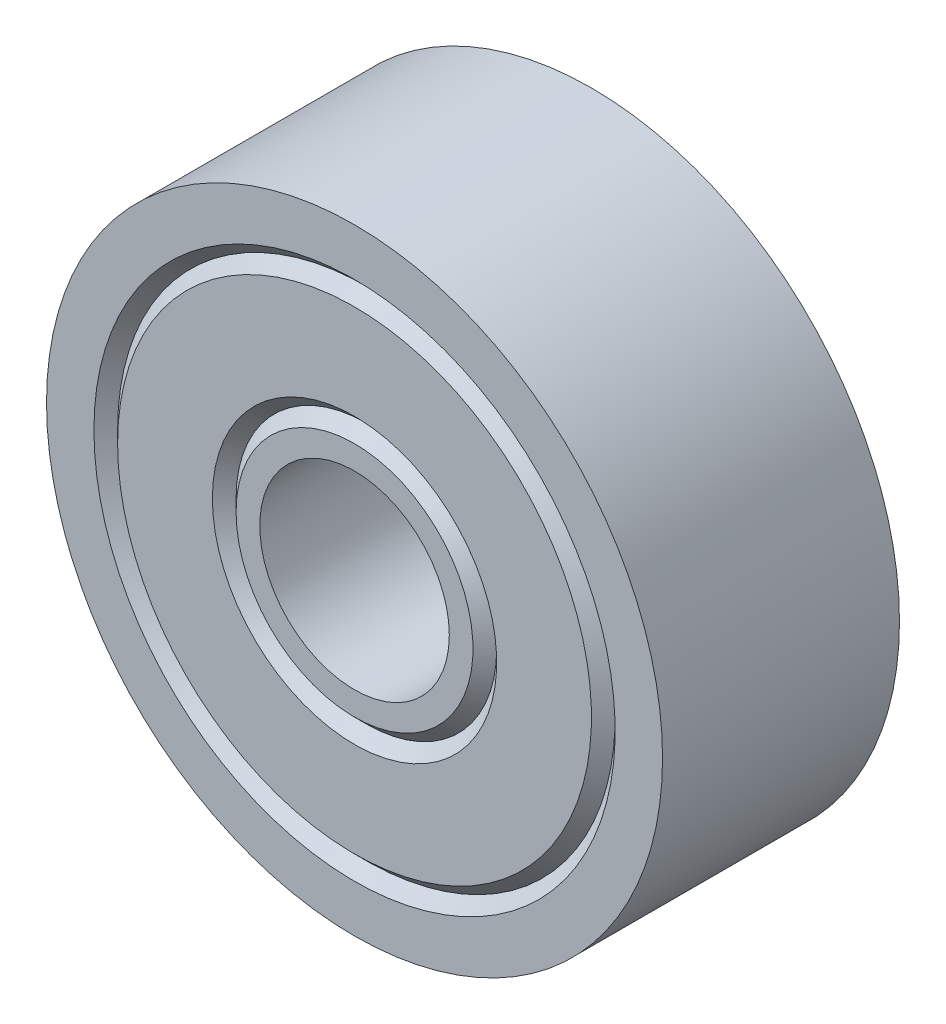
ISO-10303-21;
HEADER;
FILE_DESCRIPTION(('STEP AP214'),'2;1');
FILE_NAME('part.step','',(''),(''),'','','');
FILE_SCHEMA(('AUTOMOTIVE_DESIGN { 1 0 10303 214 1 1 1 1 }'));
ENDSEC;
DATA;
#1=APPLICATION_CONTEXT('core data for automotive mechanical design processes');
#2=APPLICATION_PROTOCOL_DEFINITION('international standard','automotive_design',2000,#1);
#3=PRODUCT_CONTEXT('',#1,'mechanical');
#4=PRODUCT('Part','Part','',(#3));
#5=PRODUCT_RELATED_PRODUCT_CATEGORY('part','',(#4));
#6=PRODUCT_DEFINITION_FORMATION('','',#4);
#7=PRODUCT_DEFINITION_CONTEXT('part definition',#1,'design');
#8=PRODUCT_DEFINITION('design','',#6,#7);
#9=PRODUCT_DEFINITION_SHAPE('','',#8);
#10=(LENGTH_UNIT() NAMED_UNIT(*) SI_UNIT(.MILLI.,.METRE.));
#11=(NAMED_UNIT(*) PLANE_ANGLE_UNIT() SI_UNIT($,.RADIAN.));
#12=(NAMED_UNIT(*) SI_UNIT($,.STERADIAN.) SOLID_ANGLE_UNIT());
#13=UNCERTAINTY_MEASURE_WITH_UNIT(LENGTH_MEASURE(1.E-05),#10,'distance_accuracy_value','');
#14=(GEOMETRIC_REPRESENTATION_CONTEXT(3) GLOBAL_UNCERTAINTY_ASSIGNED_CONTEXT((#13)) GLOBAL_UNIT_ASSIGNED_CONTEXT((#10,
#11,#12)) REPRESENTATION_CONTEXT('',''));
#15=CARTESIAN_POINT('',(0.,0.,0.));
#16=DIRECTION('',(0.,0.,1.));
#17=DIRECTION('',(1.,0.,0.));
#18=AXIS2_PLACEMENT_3D('',#15,#16,#17);
#19=CARTESIAN_POINT('',(0.,0.,0.));
#20=DIRECTION('',(0.,0.,1.));
#21=DIRECTION('',(1.,0.,0.));
#22=AXIS2_PLACEMENT_3D('',#19,#20,#21);
#23=PLANE('',#22);
#24=CARTESIAN_POINT('',(0.,0.,0.));
#25=DIRECTION('',(0.,0.,-1.));
#26=DIRECTION('',(-1.,0.,0.));
#27=AXIS2_PLACEMENT_3D('',#24,#25,#26);
#28=CIRCLE('',#27,5.);
#29=CARTESIAN_POINT('',(-5.,0.,0.));
#30=VERTEX_POINT('',#29);
#31=EDGE_CURVE('E81',#30,#30,#28,.T.);
#32=ORIENTED_EDGE('',*,*,#31,.T.);
#33=EDGE_LOOP('',(#32));
#34=FACE_BOUND('',#33,.T.);
#35=CARTESIAN_POINT('',(0.,0.,0.));
#36=DIRECTION('',(0.,0.,-1.));
#37=DIRECTION('',(-1.,0.,0.));
#38=AXIS2_PLACEMENT_3D('',#35,#36,#37);
#39=CIRCLE('',#38,3.);
#40=CARTESIAN_POINT('',(-3.,0.,0.));
#41=VERTEX_POINT('',#40);
#42=EDGE_CURVE('E69',#41,#41,#39,.T.);
#43=ORIENTED_EDGE('',*,*,#42,.F.);
#44=EDGE_LOOP('',(#43));
#45=FACE_BOUND('',#44,.T.);
#46=ADVANCED_FACE('F30',(#34,#45),#23,.F.);
#47=CARTESIAN_POINT('',(0.,0.,0.));
#48=DIRECTION('',(0.,0.,-1.));
#49=DIRECTION('',(-1.,0.,0.));
#50=AXIS2_PLACEMENT_3D('',#47,#48,#49);
#51=CIRCLE('',#50,2.5);
#52=CARTESIAN_POINT('',(-2.5,0.,0.));
#53=VERTEX_POINT('',#52);
#54=EDGE_CURVE('E72',#53,#53,#51,.T.);
#55=ORIENTED_EDGE('',*,*,#54,.T.);
#56=EDGE_LOOP('',(#55));
#57=FACE_BOUND('',#56,.T.);
#58=CARTESIAN_POINT('',(0.,0.,0.));
#59=DIRECTION('',(0.,0.,1.));
#60=DIRECTION('',(1.,0.,0.));
#61=AXIS2_PLACEMENT_3D('',#58,#59,#60);
#62=CIRCLE('',#61,2.);
#63=CARTESIAN_POINT('',(2.,0.,0.));
#64=VERTEX_POINT('',#63);
#65=EDGE_CURVE('E43',#64,#64,#62,.T.);
#66=ORIENTED_EDGE('',*,*,#65,.T.);
#67=EDGE_LOOP('',(#66));
#68=FACE_BOUND('',#67,.T.);
#69=ADVANCED_FACE('F104',(#57,#68),#23,.F.);
#70=CARTESIAN_POINT('',(0.,0.,5.));
#71=DIRECTION('',(0.,0.,1.));
#72=DIRECTION('',(1.,0.,0.));
#73=AXIS2_PLACEMENT_3D('',#70,#71,#72);
#74=PLANE('',#73);
#75=CARTESIAN_POINT('',(0.,0.,5.));
#76=DIRECTION('',(0.,0.,-1.));
#77=DIRECTION('',(-1.,0.,0.));
#78=AXIS2_PLACEMENT_3D('',#75,#76,#77);
#79=CIRCLE('',#78,3.);
#80=CARTESIAN_POINT('',(-3.,0.,5.));
#81=VERTEX_POINT('',#80);
#82=EDGE_CURVE('E63',#81,#81,#79,.T.);
#83=ORIENTED_EDGE('',*,*,#82,.T.);
#84=EDGE_LOOP('',(#83));
#85=FACE_BOUND('',#84,.T.);
#86=CARTESIAN_POINT('',(0.,0.,5.));
#87=DIRECTION('',(0.,0.,-1.));
#88=DIRECTION('',(-1.,0.,0.));
#89=AXIS2_PLACEMENT_3D('',#86,#87,#88);
#90=CIRCLE('',#89,5.);
#91=CARTESIAN_POINT('',(-5.,0.,5.));
#92=VERTEX_POINT('',#91);
#93=EDGE_CURVE('E51',#92,#92,#90,.T.);
#94=ORIENTED_EDGE('',*,*,#93,.F.);
#95=EDGE_LOOP('',(#94));
#96=FACE_BOUND('',#95,.T.);
#97=ADVANCED_FACE('F120',(#85,#96),#74,.T.);
#98=CARTESIAN_POINT('',(0.,0.,5.));
#99=DIRECTION('',(0.,0.,-1.));
#100=DIRECTION('',(-1.,0.,0.));
#101=AXIS2_PLACEMENT_3D('',#98,#99,#100);
#102=CIRCLE('',#101,5.5);
#103=CARTESIAN_POINT('',(-5.5,0.,5.));
#104=VERTEX_POINT('',#103);
#105=EDGE_CURVE('E54',#104,#104,#102,.T.);
#106=ORIENTED_EDGE('',*,*,#105,.T.);
#107=EDGE_LOOP('',(#106));
#108=FACE_BOUND('',#107,.T.);
#109=CARTESIAN_POINT('',(0.,0.,5.));
#110=DIRECTION('',(0.,0.,1.));
#111=DIRECTION('',(1.,0.,0.));
#112=AXIS2_PLACEMENT_3D('',#109,#110,#111);
#113=CIRCLE('',#112,6.5);
#114=CARTESIAN_POINT('',(6.5,0.,5.));
#115=VERTEX_POINT('',#114);
#116=EDGE_CURVE('E10',#115,#115,#113,.T.);
#117=ORIENTED_EDGE('',*,*,#116,.T.);
#118=EDGE_LOOP('',(#117));
#119=FACE_BOUND('',#118,.T.);
#120=ADVANCED_FACE('F124',(#108,#119),#74,.T.);
#121=CARTESIAN_POINT('',(0.,0.,5.));
#122=DIRECTION('',(0.,0.,-1.));
#123=DIRECTION('',(-1.,0.,0.));
#124=AXIS2_PLACEMENT_3D('',#121,#122,#123);
#125=CIRCLE('',#124,2.5);
#126=CARTESIAN_POINT('',(-2.5,0.,5.));
#127=VERTEX_POINT('',#126);
#128=EDGE_CURVE('E60',#127,#127,#125,.T.);
#129=ORIENTED_EDGE('',*,*,#128,.F.);
#130=EDGE_LOOP('',(#129));
#131=FACE_BOUND('',#130,.T.);
#132=CARTESIAN_POINT('',(0.,0.,5.));
#133=DIRECTION('',(0.,0.,1.));
#134=DIRECTION('',(1.,0.,0.));
#135=AXIS2_PLACEMENT_3D('',#132,#133,#134);
#136=CIRCLE('',#135,2.);
#137=CARTESIAN_POINT('',(2.,0.,5.));
#138=VERTEX_POINT('',#137);
#139=EDGE_CURVE('E41',#138,#138,#136,.T.);
#140=ORIENTED_EDGE('',*,*,#139,.F.);
#141=EDGE_LOOP('',(#140));
#142=FACE_BOUND('',#141,.T.);
#143=ADVANCED_FACE('F103',(#131,#142),#74,.T.);
#144=CARTESIAN_POINT('',(0.,0.,0.));
#145=DIRECTION('',(0.,0.,-1.));
#146=DIRECTION('',(-1.,0.,0.));
#147=AXIS2_PLACEMENT_3D('',#144,#145,#146);
#148=CIRCLE('',#147,5.5);
#149=CARTESIAN_POINT('',(-5.5,0.,0.));
#150=VERTEX_POINT('',#149);
#151=EDGE_CURVE('E78',#150,#150,#148,.T.);
#152=ORIENTED_EDGE('',*,*,#151,.F.);
#153=EDGE_LOOP('',(#152));
#154=FACE_BOUND('',#153,.T.);
#155=CARTESIAN_POINT('',(0.,0.,0.));
#156=DIRECTION('',(0.,0.,1.));
#157=DIRECTION('',(1.,0.,0.));
#158=AXIS2_PLACEMENT_3D('',#155,#156,#157);
#159=CIRCLE('',#158,6.5);
#160=CARTESIAN_POINT('',(6.5,0.,0.));
#161=VERTEX_POINT('',#160);
#162=EDGE_CURVE('E34',#161,#161,#159,.T.);
#163=ORIENTED_EDGE('',*,*,#162,.F.);
#164=EDGE_LOOP('',(#163));
#165=FACE_BOUND('',#164,.T.);
#166=ADVANCED_FACE('F100',(#154,#165),#23,.F.);
#167=CARTESIAN_POINT('',(0.,0.,5.));
#168=DIRECTION('',(0.,0.,-1.));
#169=DIRECTION('',(-1.,0.,0.));
#170=AXIS2_PLACEMENT_3D('',#167,#168,#169);
#171=CYLINDRICAL_SURFACE('',#170,6.5);
#172=ORIENTED_EDGE('',*,*,#116,.F.);
#173=EDGE_LOOP('',(#172));
#174=FACE_BOUND('',#173,.T.);
#175=ORIENTED_EDGE('',*,*,#162,.T.);
#176=EDGE_LOOP('',(#175));
#177=FACE_BOUND('',#176,.T.);
#178=ADVANCED_FACE('F32',(#174,#177),#171,.T.);
#179=CARTESIAN_POINT('',(0.,0.,5.));
#180=DIRECTION('',(0.,0.,-1.));
#181=DIRECTION('',(-1.,0.,0.));
#182=AXIS2_PLACEMENT_3D('',#179,#180,#181);
#183=CYLINDRICAL_SURFACE('',#182,2.);
#184=ORIENTED_EDGE('',*,*,#139,.T.);
#185=EDGE_LOOP('',(#184));
#186=FACE_BOUND('',#185,.T.);
#187=ORIENTED_EDGE('',*,*,#65,.F.);
#188=EDGE_LOOP('',(#187));
#189=FACE_BOUND('',#188,.T.);
#190=ADVANCED_FACE('F108',(#186,#189),#183,.F.);
#191=CARTESIAN_POINT('',(0.,0.,4.75));
#192=DIRECTION('',(0.,0.,1.));
#193=DIRECTION('',(1.,0.,0.));
#194=AXIS2_PLACEMENT_3D('',#191,#192,#193);
#195=CONICAL_SURFACE('',#194,5.25,0.785398163397453);
#196=ORIENTED_EDGE('',*,*,#105,.F.);
#197=EDGE_LOOP('',(#196));
#198=FACE_BOUND('',#197,.T.);
#199=CARTESIAN_POINT('',(0.,0.,4.75));
#200=DIRECTION('',(0.,0.,-1.));
#201=DIRECTION('',(-1.,0.,0.));
#202=AXIS2_PLACEMENT_3D('',#199,#200,#201);
#203=CIRCLE('',#202,5.25);
#204=CARTESIAN_POINT('',(-5.25,0.,4.75));
#205=VERTEX_POINT('',#204);
#206=EDGE_CURVE('E46',#205,#205,#203,.T.);
#207=ORIENTED_EDGE('',*,*,#206,.T.);
#208=EDGE_LOOP('',(#207));
#209=FACE_BOUND('',#208,.T.);
#210=ADVANCED_FACE('F113',(#198,#209),#195,.F.);
#211=CARTESIAN_POINT('',(0.,0.,5.));
#212=DIRECTION('',(0.,0.,-1.));
#213=DIRECTION('',(-1.,0.,0.));
#214=AXIS2_PLACEMENT_3D('',#211,#212,#213);
#215=CONICAL_SURFACE('',#214,5.,0.785398163397448);
#216=ORIENTED_EDGE('',*,*,#206,.F.);
#217=EDGE_LOOP('',(#216));
#218=FACE_BOUND('',#217,.T.);
#219=ORIENTED_EDGE('',*,*,#93,.T.);
#220=EDGE_LOOP('',(#219));
#221=FACE_BOUND('',#220,.T.);
#222=ADVANCED_FACE('F129',(#218,#221),#215,.T.);
#223=CARTESIAN_POINT('',(0.,0.,4.75));
#224=DIRECTION('',(0.,0.,1.));
#225=DIRECTION('',(1.,0.,0.));
#226=AXIS2_PLACEMENT_3D('',#223,#224,#225);
#227=CONICAL_SURFACE('',#226,2.75,0.785398163397448);
#228=ORIENTED_EDGE('',*,*,#82,.F.);
#229=EDGE_LOOP('',(#228));
#230=FACE_BOUND('',#229,.T.);
#231=CARTESIAN_POINT('',(0.,0.,4.75));
#232=DIRECTION('',(0.,0.,-1.));
#233=DIRECTION('',(-1.,0.,0.));
#234=AXIS2_PLACEMENT_3D('',#231,#232,#233);
#235=CIRCLE('',#234,2.75);
#236=CARTESIAN_POINT('',(-2.75,0.,4.75));
#237=VERTEX_POINT('',#236);
#238=EDGE_CURVE('E57',#237,#237,#235,.T.);
#239=ORIENTED_EDGE('',*,*,#238,.T.);
#240=EDGE_LOOP('',(#239));
#241=FACE_BOUND('',#240,.T.);
#242=ADVANCED_FACE('F133',(#230,#241),#227,.F.);
#243=CARTESIAN_POINT('',(0.,0.,5.));
#244=DIRECTION('',(0.,0.,-1.));
#245=DIRECTION('',(-1.,0.,0.));
#246=AXIS2_PLACEMENT_3D('',#243,#244,#245);
#247=CONICAL_SURFACE('',#246,2.5,0.785398163397448);
#248=ORIENTED_EDGE('',*,*,#238,.F.);
#249=EDGE_LOOP('',(#248));
#250=FACE_BOUND('',#249,.T.);
#251=ORIENTED_EDGE('',*,*,#128,.T.);
#252=EDGE_LOOP('',(#251));
#253=FACE_BOUND('',#252,.T.);
#254=ADVANCED_FACE('F137',(#250,#253),#247,.T.);
#255=CARTESIAN_POINT('',(0.,0.,0.249999999999999));
#256=DIRECTION('',(0.,0.,1.));
#257=DIRECTION('',(1.,0.,0.));
#258=AXIS2_PLACEMENT_3D('',#255,#256,#257);
#259=CONICAL_SURFACE('',#258,2.75,0.785398163397448);
#260=ORIENTED_EDGE('',*,*,#54,.F.);
#261=EDGE_LOOP('',(#260));
#262=FACE_BOUND('',#261,.T.);
#263=CARTESIAN_POINT('',(0.,0.,0.249999999999999));
#264=DIRECTION('',(0.,0.,-1.));
#265=DIRECTION('',(-1.,0.,0.));
#266=AXIS2_PLACEMENT_3D('',#263,#264,#265);
#267=CIRCLE('',#266,2.75);
#268=CARTESIAN_POINT('',(-2.75,0.,0.249999999999999));
#269=VERTEX_POINT('',#268);
#270=EDGE_CURVE('E66',#269,#269,#267,.T.);
#271=ORIENTED_EDGE('',*,*,#270,.T.);
#272=EDGE_LOOP('',(#271));
#273=FACE_BOUND('',#272,.T.);
#274=ADVANCED_FACE('F141',(#262,#273),#259,.T.);
#275=CARTESIAN_POINT('',(0.,0.,0.));
#276=DIRECTION('',(0.,0.,-1.));
#277=DIRECTION('',(-1.,0.,0.));
#278=AXIS2_PLACEMENT_3D('',#275,#276,#277);
#279=CONICAL_SURFACE('',#278,3.,0.785398163397448);
#280=ORIENTED_EDGE('',*,*,#270,.F.);
#281=EDGE_LOOP('',(#280));
#282=FACE_BOUND('',#281,.T.);
#283=ORIENTED_EDGE('',*,*,#42,.T.);
#284=EDGE_LOOP('',(#283));
#285=FACE_BOUND('',#284,.T.);
#286=ADVANCED_FACE('F91',(#282,#285),#279,.F.);
#287=CARTESIAN_POINT('',(0.,0.,0.249999999999999));
#288=DIRECTION('',(0.,0.,1.));
#289=DIRECTION('',(1.,0.,0.));
#290=AXIS2_PLACEMENT_3D('',#287,#288,#289);
#291=CONICAL_SURFACE('',#290,5.25,0.785398163397448);
#292=ORIENTED_EDGE('',*,*,#31,.F.);
#293=EDGE_LOOP('',(#292));
#294=FACE_BOUND('',#293,.T.);
#295=CARTESIAN_POINT('',(0.,0.,0.249999999999999));
#296=DIRECTION('',(0.,0.,-1.));
#297=DIRECTION('',(-1.,0.,0.));
#298=AXIS2_PLACEMENT_3D('',#295,#296,#297);
#299=CIRCLE('',#298,5.25);
#300=CARTESIAN_POINT('',(-5.25,0.,0.249999999999999));
#301=VERTEX_POINT('',#300);
#302=EDGE_CURVE('E75',#301,#301,#299,.T.);
#303=ORIENTED_EDGE('',*,*,#302,.T.);
#304=EDGE_LOOP('',(#303));
#305=FACE_BOUND('',#304,.T.);
#306=ADVANCED_FACE('F87',(#294,#305),#291,.T.);
#307=CARTESIAN_POINT('',(0.,0.,0.));
#308=DIRECTION('',(0.,0.,-1.));
#309=DIRECTION('',(-1.,0.,0.));
#310=AXIS2_PLACEMENT_3D('',#307,#308,#309);
#311=CONICAL_SURFACE('',#310,5.5,0.785398163397453);
#312=ORIENTED_EDGE('',*,*,#302,.F.);
#313=EDGE_LOOP('',(#312));
#314=FACE_BOUND('',#313,.T.);
#315=ORIENTED_EDGE('',*,*,#151,.T.);
#316=EDGE_LOOP('',(#315));
#317=FACE_BOUND('',#316,.T.);
#318=ADVANCED_FACE('F90',(#314,#317),#311,.F.);
#319=CLOSED_SHELL('',(#46,#69,#97,#120,#143,#166,#178,#190,#210,#222,#242,#254,#274,#286,#306,#318));
#320=MANIFOLD_SOLID_BREP('B2',#319);
#321=ADVANCED_BREP_SHAPE_REPRESENTATION('',(#18,#320),#14);
#322=SHAPE_DEFINITION_REPRESENTATION(#9,#321);
ENDSEC;
END-ISO-10303-21;
